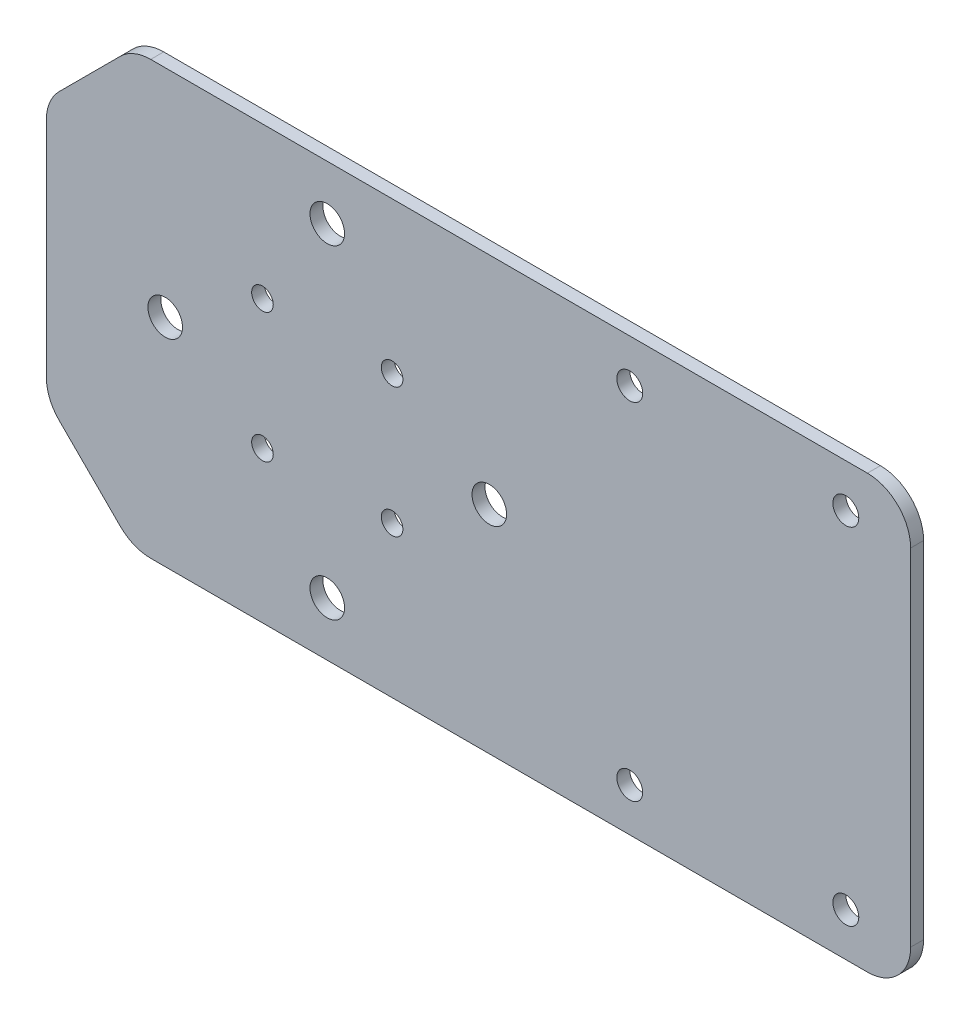
ISO-10303-21;
HEADER;
FILE_DESCRIPTION(('STEP AP214'),'2;1');
FILE_NAME('part.step','',(''),(''),'','','');
FILE_SCHEMA(('AUTOMOTIVE_DESIGN { 1 0 10303 214 1 1 1 1 }'));
ENDSEC;
DATA;
#1=APPLICATION_CONTEXT('core data for automotive mechanical design processes');
#2=APPLICATION_PROTOCOL_DEFINITION('international standard','automotive_design',2000,#1);
#3=PRODUCT_CONTEXT('',#1,'mechanical');
#4=PRODUCT('Part','Part','',(#3));
#5=PRODUCT_RELATED_PRODUCT_CATEGORY('part','',(#4));
#6=PRODUCT_DEFINITION_FORMATION('','',#4);
#7=PRODUCT_DEFINITION_CONTEXT('part definition',#1,'design');
#8=PRODUCT_DEFINITION('design','',#6,#7);
#9=PRODUCT_DEFINITION_SHAPE('','',#8);
#10=(LENGTH_UNIT() NAMED_UNIT(*) SI_UNIT(.MILLI.,.METRE.));
#11=(NAMED_UNIT(*) PLANE_ANGLE_UNIT() SI_UNIT($,.RADIAN.));
#12=(NAMED_UNIT(*) SI_UNIT($,.STERADIAN.) SOLID_ANGLE_UNIT());
#13=UNCERTAINTY_MEASURE_WITH_UNIT(LENGTH_MEASURE(1.E-05),#10,'distance_accuracy_value','');
#14=(GEOMETRIC_REPRESENTATION_CONTEXT(3) GLOBAL_UNCERTAINTY_ASSIGNED_CONTEXT((#13)) GLOBAL_UNIT_ASSIGNED_CONTEXT((#10,
#11,#12)) REPRESENTATION_CONTEXT('',''));
#15=CARTESIAN_POINT('',(0.,0.,0.));
#16=DIRECTION('',(0.,0.,1.));
#17=DIRECTION('',(1.,0.,0.));
#18=AXIS2_PLACEMENT_3D('',#15,#16,#17);
#19=CARTESIAN_POINT('',(15.,15.,7.));
#20=DIRECTION('',(0.,0.,1.));
#21=DIRECTION('',(1.,0.,0.));
#22=AXIS2_PLACEMENT_3D('',#19,#20,#21);
#23=CYLINDRICAL_SURFACE('',#22,2.49999999999999);
#24=CARTESIAN_POINT('',(15.,15.,0.));
#25=DIRECTION('',(0.,0.,1.));
#26=DIRECTION('',(1.,0.,0.));
#27=AXIS2_PLACEMENT_3D('',#24,#25,#26);
#28=CIRCLE('',#27,2.5);
#29=CARTESIAN_POINT('',(17.5,15.,0.));
#30=VERTEX_POINT('',#29);
#31=EDGE_CURVE('E209',#30,#30,#28,.T.);
#32=ORIENTED_EDGE('',*,*,#31,.F.);
#33=EDGE_LOOP('',(#32));
#34=FACE_BOUND('',#33,.T.);
#35=CARTESIAN_POINT('',(15.,15.,3.));
#36=DIRECTION('',(0.,0.,1.));
#37=DIRECTION('',(1.,0.,0.));
#38=AXIS2_PLACEMENT_3D('',#35,#36,#37);
#39=CIRCLE('',#38,2.49999999999999);
#40=CARTESIAN_POINT('',(17.5,15.,3.));
#41=VERTEX_POINT('',#40);
#42=EDGE_CURVE('E266',#41,#41,#39,.T.);
#43=ORIENTED_EDGE('',*,*,#42,.T.);
#44=EDGE_LOOP('',(#43));
#45=FACE_BOUND('',#44,.T.);
#46=ADVANCED_FACE('F35',(#34,#45),#23,.F.);
#47=CARTESIAN_POINT('',(-15.,15.,7.));
#48=DIRECTION('',(0.,0.,1.));
#49=DIRECTION('',(1.,0.,0.));
#50=AXIS2_PLACEMENT_3D('',#47,#48,#49);
#51=CYLINDRICAL_SURFACE('',#50,2.49999999999999);
#52=CARTESIAN_POINT('',(-15.,15.,0.));
#53=DIRECTION('',(0.,0.,1.));
#54=DIRECTION('',(1.,0.,0.));
#55=AXIS2_PLACEMENT_3D('',#52,#53,#54);
#56=CIRCLE('',#55,2.5);
#57=CARTESIAN_POINT('',(-12.5,15.,0.));
#58=VERTEX_POINT('',#57);
#59=EDGE_CURVE('E206',#58,#58,#56,.T.);
#60=ORIENTED_EDGE('',*,*,#59,.F.);
#61=EDGE_LOOP('',(#60));
#62=FACE_BOUND('',#61,.T.);
#63=CARTESIAN_POINT('',(-15.,15.,3.));
#64=DIRECTION('',(0.,0.,1.));
#65=DIRECTION('',(1.,0.,0.));
#66=AXIS2_PLACEMENT_3D('',#63,#64,#65);
#67=CIRCLE('',#66,2.49999999999999);
#68=CARTESIAN_POINT('',(-12.5,15.,3.));
#69=VERTEX_POINT('',#68);
#70=EDGE_CURVE('E261',#69,#69,#67,.T.);
#71=ORIENTED_EDGE('',*,*,#70,.T.);
#72=EDGE_LOOP('',(#71));
#73=FACE_BOUND('',#72,.T.);
#74=ADVANCED_FACE('F336',(#62,#73),#51,.F.);
#75=CARTESIAN_POINT('',(0.,0.,3.));
#76=DIRECTION('',(0.,0.,1.));
#77=DIRECTION('',(1.,0.,0.));
#78=AXIS2_PLACEMENT_3D('',#75,#76,#77);
#79=PLANE('',#78);
#80=CARTESIAN_POINT('',(37.5,0.,3.));
#81=DIRECTION('',(0.,0.,1.));
#82=DIRECTION('',(1.,0.,0.));
#83=AXIS2_PLACEMENT_3D('',#80,#81,#82);
#84=CIRCLE('',#83,4.);
#85=CARTESIAN_POINT('',(41.5,0.,3.));
#86=VERTEX_POINT('',#85);
#87=EDGE_CURVE('E254',#86,#86,#84,.T.);
#88=ORIENTED_EDGE('',*,*,#87,.F.);
#89=EDGE_LOOP('',(#88));
#90=FACE_BOUND('',#89,.T.);
#91=CARTESIAN_POINT('',(-15.,-15.,3.));
#92=DIRECTION('',(0.,0.,1.));
#93=DIRECTION('',(1.,0.,0.));
#94=AXIS2_PLACEMENT_3D('',#91,#92,#93);
#95=CIRCLE('',#94,2.49999999999999);
#96=CARTESIAN_POINT('',(-12.5,-15.,3.));
#97=VERTEX_POINT('',#96);
#98=EDGE_CURVE('E216',#97,#97,#95,.T.);
#99=ORIENTED_EDGE('',*,*,#98,.F.);
#100=EDGE_LOOP('',(#99));
#101=FACE_BOUND('',#100,.T.);
#102=CARTESIAN_POINT('',(15.,-15.,3.));
#103=DIRECTION('',(0.,0.,1.));
#104=DIRECTION('',(1.,0.,0.));
#105=AXIS2_PLACEMENT_3D('',#102,#103,#104);
#106=CIRCLE('',#105,2.49999999999999);
#107=CARTESIAN_POINT('',(17.5,-15.,3.));
#108=VERTEX_POINT('',#107);
#109=EDGE_CURVE('E222',#108,#108,#106,.T.);
#110=ORIENTED_EDGE('',*,*,#109,.F.);
#111=EDGE_LOOP('',(#110));
#112=FACE_BOUND('',#111,.T.);
#113=CARTESIAN_POINT('',(-37.5,3.92791650619852E-13,3.));
#114=DIRECTION('',(0.,0.,1.));
#115=DIRECTION('',(1.,0.,0.));
#116=AXIS2_PLACEMENT_3D('',#113,#114,#115);
#117=CIRCLE('',#116,4.00000000000001);
#118=CARTESIAN_POINT('',(-33.5,3.92791650619852E-13,3.));
#119=VERTEX_POINT('',#118);
#120=EDGE_CURVE('E223',#119,#119,#117,.T.);
#121=ORIENTED_EDGE('',*,*,#120,.F.);
#122=EDGE_LOOP('',(#121));
#123=FACE_BOUND('',#122,.T.);
#124=CARTESIAN_POINT('',(-2.61861100413235E-13,-37.5,3.));
#125=DIRECTION('',(0.,0.,1.));
#126=DIRECTION('',(1.,0.,0.));
#127=AXIS2_PLACEMENT_3D('',#124,#125,#126);
#128=CIRCLE('',#127,4.);
#129=CARTESIAN_POINT('',(3.99999999999974,-37.5,3.));
#130=VERTEX_POINT('',#129);
#131=EDGE_CURVE('E226',#130,#130,#128,.T.);
#132=ORIENTED_EDGE('',*,*,#131,.F.);
#133=EDGE_LOOP('',(#132));
#134=FACE_BOUND('',#133,.T.);
#135=CARTESIAN_POINT('',(0.,37.5,3.));
#136=DIRECTION('',(0.,0.,1.));
#137=DIRECTION('',(1.,0.,0.));
#138=AXIS2_PLACEMENT_3D('',#135,#136,#137);
#139=CIRCLE('',#138,4.);
#140=CARTESIAN_POINT('',(4.,37.5,3.));
#141=VERTEX_POINT('',#140);
#142=EDGE_CURVE('E230',#141,#141,#139,.T.);
#143=ORIENTED_EDGE('',*,*,#142,.F.);
#144=EDGE_LOOP('',(#143));
#145=FACE_BOUND('',#144,.T.);
#146=CARTESIAN_POINT('',(70.,-40.0019960171061,3.));
#147=DIRECTION('',(0.,0.,1.));
#148=DIRECTION('',(1.,0.,0.));
#149=AXIS2_PLACEMENT_3D('',#146,#147,#148);
#150=CIRCLE('',#149,3.00000000000002);
#151=CARTESIAN_POINT('',(73.,-40.0019960171061,3.));
#152=VERTEX_POINT('',#151);
#153=EDGE_CURVE('E271',#152,#152,#150,.T.);
#154=ORIENTED_EDGE('',*,*,#153,.F.);
#155=EDGE_LOOP('',(#154));
#156=FACE_BOUND('',#155,.T.);
#157=CARTESIAN_POINT('',(119.999999960159,-40.,3.));
#158=DIRECTION('',(0.,0.,1.));
#159=DIRECTION('',(1.,0.,0.));
#160=AXIS2_PLACEMENT_3D('',#157,#158,#159);
#161=CIRCLE('',#160,2.99999999999999);
#162=CARTESIAN_POINT('',(122.999999960159,-40.,3.));
#163=VERTEX_POINT('',#162);
#164=EDGE_CURVE('E276',#163,#163,#161,.T.);
#165=ORIENTED_EDGE('',*,*,#164,.F.);
#166=EDGE_LOOP('',(#165));
#167=FACE_BOUND('',#166,.T.);
#168=CARTESIAN_POINT('',(119.999999960159,40.,3.));
#169=DIRECTION('',(0.,0.,1.));
#170=DIRECTION('',(1.,0.,0.));
#171=AXIS2_PLACEMENT_3D('',#168,#169,#170);
#172=CIRCLE('',#171,2.99999999999999);
#173=CARTESIAN_POINT('',(122.999999960159,40.,3.));
#174=VERTEX_POINT('',#173);
#175=EDGE_CURVE('E282',#174,#174,#172,.T.);
#176=ORIENTED_EDGE('',*,*,#175,.F.);
#177=EDGE_LOOP('',(#176));
#178=FACE_BOUND('',#177,.T.);
#179=CARTESIAN_POINT('',(70.,39.9980039828939,3.));
#180=DIRECTION('',(0.,0.,1.));
#181=DIRECTION('',(1.,0.,0.));
#182=AXIS2_PLACEMENT_3D('',#179,#180,#181);
#183=CIRCLE('',#182,3.00000000000002);
#184=CARTESIAN_POINT('',(73.,39.9980039828939,3.));
#185=VERTEX_POINT('',#184);
#186=EDGE_CURVE('E288',#185,#185,#183,.T.);
#187=ORIENTED_EDGE('',*,*,#186,.F.);
#188=EDGE_LOOP('',(#187));
#189=FACE_BOUND('',#188,.T.);
#190=DIRECTION('',(-0.707106781186549,0.707106781186546,0.));
#191=VECTOR('',#190,1.);
#192=CARTESIAN_POINT('',(-47.4999999999999,-47.5,3.));
#193=LINE('',#192,#191);
#194=CARTESIAN_POINT('',(-62.0710678118655,-32.9289321881345,3.));
#195=VERTEX_POINT('',#194);
#196=CARTESIAN_POINT('',(-47.9289321881344,-47.0710678118655,3.));
#197=VERTEX_POINT('',#196);
#198=EDGE_CURVE('E130',#195,#197,#193,.F.);
#199=ORIENTED_EDGE('',*,*,#198,.T.);
#200=CARTESIAN_POINT('',(-40.857864376269,-40.,3.));
#201=DIRECTION('',(0.,0.,1.));
#202=DIRECTION('',(1.,0.,0.));
#203=AXIS2_PLACEMENT_3D('',#200,#201,#202);
#204=CIRCLE('',#203,10.);
#205=CARTESIAN_POINT('',(-40.857864376269,-50.,3.));
#206=VERTEX_POINT('',#205);
#207=EDGE_CURVE('E124',#197,#206,#204,.T.);
#208=ORIENTED_EDGE('',*,*,#207,.T.);
#209=DIRECTION('',(1.,0.,0.));
#210=VECTOR('',#209,1.);
#211=CARTESIAN_POINT('',(25.,-50.,3.));
#212=LINE('',#211,#210);
#213=CARTESIAN_POINT('',(125.,-50.,3.));
#214=VERTEX_POINT('',#213);
#215=EDGE_CURVE('E128',#206,#214,#212,.T.);
#216=ORIENTED_EDGE('',*,*,#215,.T.);
#217=CARTESIAN_POINT('',(125.,-40.,3.));
#218=DIRECTION('',(0.,0.,1.));
#219=DIRECTION('',(1.,0.,0.));
#220=AXIS2_PLACEMENT_3D('',#217,#218,#219);
#221=CIRCLE('',#220,10.);
#222=CARTESIAN_POINT('',(135.,-40.,3.));
#223=VERTEX_POINT('',#222);
#224=EDGE_CURVE('E58',#214,#223,#221,.T.);
#225=ORIENTED_EDGE('',*,*,#224,.T.);
#226=DIRECTION('',(0.,1.,0.));
#227=VECTOR('',#226,1.);
#228=CARTESIAN_POINT('',(135.,-50.,3.));
#229=LINE('',#228,#227);
#230=CARTESIAN_POINT('',(135.,40.,3.));
#231=VERTEX_POINT('',#230);
#232=EDGE_CURVE('E146',#223,#231,#229,.T.);
#233=ORIENTED_EDGE('',*,*,#232,.T.);
#234=CARTESIAN_POINT('',(125.,40.,3.));
#235=DIRECTION('',(0.,0.,1.));
#236=DIRECTION('',(1.,0.,0.));
#237=AXIS2_PLACEMENT_3D('',#234,#235,#236);
#238=CIRCLE('',#237,10.);
#239=CARTESIAN_POINT('',(125.,50.,3.));
#240=VERTEX_POINT('',#239);
#241=EDGE_CURVE('E50',#231,#240,#238,.T.);
#242=ORIENTED_EDGE('',*,*,#241,.T.);
#243=DIRECTION('',(-1.,0.,0.));
#244=VECTOR('',#243,1.);
#245=CARTESIAN_POINT('',(25.,50.,3.));
#246=LINE('',#245,#244);
#247=CARTESIAN_POINT('',(-40.857864376269,50.,3.));
#248=VERTEX_POINT('',#247);
#249=EDGE_CURVE('E200',#240,#248,#246,.T.);
#250=ORIENTED_EDGE('',*,*,#249,.T.);
#251=CARTESIAN_POINT('',(-40.857864376269,40.,3.));
#252=DIRECTION('',(0.,0.,1.));
#253=DIRECTION('',(1.,0.,0.));
#254=AXIS2_PLACEMENT_3D('',#251,#252,#253);
#255=CIRCLE('',#254,10.);
#256=CARTESIAN_POINT('',(-47.9289321881345,47.0710678118655,3.));
#257=VERTEX_POINT('',#256);
#258=EDGE_CURVE('E173',#248,#257,#255,.T.);
#259=ORIENTED_EDGE('',*,*,#258,.T.);
#260=DIRECTION('',(0.707106781186546,0.707106781186549,0.));
#261=VECTOR('',#260,1.);
#262=CARTESIAN_POINT('',(-47.5,47.4999999999999,3.));
#263=LINE('',#262,#261);
#264=CARTESIAN_POINT('',(-62.0710678118655,32.9289321881344,3.));
#265=VERTEX_POINT('',#264);
#266=EDGE_CURVE('E244',#257,#265,#263,.F.);
#267=ORIENTED_EDGE('',*,*,#266,.T.);
#268=CARTESIAN_POINT('',(-55.,25.8578643762689,3.));
#269=DIRECTION('',(0.,0.,1.));
#270=DIRECTION('',(1.,0.,0.));
#271=AXIS2_PLACEMENT_3D('',#268,#269,#270);
#272=CIRCLE('',#271,10.);
#273=CARTESIAN_POINT('',(-65.,25.8578643762689,3.));
#274=VERTEX_POINT('',#273);
#275=EDGE_CURVE('E175',#265,#274,#272,.T.);
#276=ORIENTED_EDGE('',*,*,#275,.T.);
#277=DIRECTION('',(0.,-1.,0.));
#278=VECTOR('',#277,1.);
#279=CARTESIAN_POINT('',(-65.,0.,3.));
#280=LINE('',#279,#278);
#281=CARTESIAN_POINT('',(-65.,-25.857864376269,3.));
#282=VERTEX_POINT('',#281);
#283=EDGE_CURVE('E253',#274,#282,#280,.T.);
#284=ORIENTED_EDGE('',*,*,#283,.T.);
#285=CARTESIAN_POINT('',(-55.,-25.857864376269,3.));
#286=DIRECTION('',(0.,0.,1.));
#287=DIRECTION('',(1.,0.,0.));
#288=AXIS2_PLACEMENT_3D('',#285,#286,#287);
#289=CIRCLE('',#288,10.);
#290=EDGE_CURVE('E135',#282,#195,#289,.T.);
#291=ORIENTED_EDGE('',*,*,#290,.T.);
#292=EDGE_LOOP('',(#199,#208,#216,#225,#233,#242,#250,#259,#267,#276,#284,#291));
#293=FACE_BOUND('',#292,.T.);
#294=ORIENTED_EDGE('',*,*,#42,.F.);
#295=EDGE_LOOP('',(#294));
#296=FACE_BOUND('',#295,.T.);
#297=ORIENTED_EDGE('',*,*,#70,.F.);
#298=EDGE_LOOP('',(#297));
#299=FACE_BOUND('',#298,.T.);
#300=ADVANCED_FACE('F126',(#90,#101,#112,#123,#134,#145,#156,#167,#178,#189,#293,#296,#299),#79,.T.);
#301=CARTESIAN_POINT('',(0.,0.,0.));
#302=DIRECTION('',(0.,0.,1.));
#303=DIRECTION('',(1.,0.,0.));
#304=AXIS2_PLACEMENT_3D('',#301,#302,#303);
#305=PLANE('',#304);
#306=CARTESIAN_POINT('',(37.5,0.,0.));
#307=DIRECTION('',(0.,0.,1.));
#308=DIRECTION('',(1.,0.,0.));
#309=AXIS2_PLACEMENT_3D('',#306,#307,#308);
#310=CIRCLE('',#309,4.);
#311=CARTESIAN_POINT('',(41.5,0.,0.));
#312=VERTEX_POINT('',#311);
#313=EDGE_CURVE('E251',#312,#312,#310,.T.);
#314=ORIENTED_EDGE('',*,*,#313,.T.);
#315=EDGE_LOOP('',(#314));
#316=FACE_BOUND('',#315,.T.);
#317=ORIENTED_EDGE('',*,*,#59,.T.);
#318=EDGE_LOOP('',(#317));
#319=FACE_BOUND('',#318,.T.);
#320=ORIENTED_EDGE('',*,*,#31,.T.);
#321=EDGE_LOOP('',(#320));
#322=FACE_BOUND('',#321,.T.);
#323=CARTESIAN_POINT('',(-15.,-15.,0.));
#324=DIRECTION('',(0.,0.,1.));
#325=DIRECTION('',(1.,0.,0.));
#326=AXIS2_PLACEMENT_3D('',#323,#324,#325);
#327=CIRCLE('',#326,2.5);
#328=CARTESIAN_POINT('',(-12.5,-15.,0.));
#329=VERTEX_POINT('',#328);
#330=EDGE_CURVE('E213',#329,#329,#327,.T.);
#331=ORIENTED_EDGE('',*,*,#330,.T.);
#332=EDGE_LOOP('',(#331));
#333=FACE_BOUND('',#332,.T.);
#334=CARTESIAN_POINT('',(15.,-15.,0.));
#335=DIRECTION('',(0.,0.,1.));
#336=DIRECTION('',(1.,0.,0.));
#337=AXIS2_PLACEMENT_3D('',#334,#335,#336);
#338=CIRCLE('',#337,2.5);
#339=CARTESIAN_POINT('',(17.5,-15.,0.));
#340=VERTEX_POINT('',#339);
#341=EDGE_CURVE('E219',#340,#340,#338,.T.);
#342=ORIENTED_EDGE('',*,*,#341,.T.);
#343=EDGE_LOOP('',(#342));
#344=FACE_BOUND('',#343,.T.);
#345=CARTESIAN_POINT('',(-37.5,3.92791650619852E-13,0.));
#346=DIRECTION('',(0.,0.,1.));
#347=DIRECTION('',(1.,0.,0.));
#348=AXIS2_PLACEMENT_3D('',#345,#346,#347);
#349=CIRCLE('',#348,4.00000000000001);
#350=CARTESIAN_POINT('',(-33.5,3.92791650619852E-13,0.));
#351=VERTEX_POINT('',#350);
#352=EDGE_CURVE('E233',#351,#351,#349,.T.);
#353=ORIENTED_EDGE('',*,*,#352,.T.);
#354=EDGE_LOOP('',(#353));
#355=FACE_BOUND('',#354,.T.);
#356=CARTESIAN_POINT('',(-2.61861100413235E-13,-37.5,0.));
#357=DIRECTION('',(0.,0.,1.));
#358=DIRECTION('',(1.,0.,0.));
#359=AXIS2_PLACEMENT_3D('',#356,#357,#358);
#360=CIRCLE('',#359,4.);
#361=CARTESIAN_POINT('',(3.99999999999974,-37.5,0.));
#362=VERTEX_POINT('',#361);
#363=EDGE_CURVE('E236',#362,#362,#360,.T.);
#364=ORIENTED_EDGE('',*,*,#363,.T.);
#365=EDGE_LOOP('',(#364));
#366=FACE_BOUND('',#365,.T.);
#367=CARTESIAN_POINT('',(0.,37.5,0.));
#368=DIRECTION('',(0.,0.,1.));
#369=DIRECTION('',(1.,0.,0.));
#370=AXIS2_PLACEMENT_3D('',#367,#368,#369);
#371=CIRCLE('',#370,4.);
#372=CARTESIAN_POINT('',(4.,37.5,0.));
#373=VERTEX_POINT('',#372);
#374=EDGE_CURVE('E227',#373,#373,#371,.T.);
#375=ORIENTED_EDGE('',*,*,#374,.T.);
#376=EDGE_LOOP('',(#375));
#377=FACE_BOUND('',#376,.T.);
#378=CARTESIAN_POINT('',(70.,-40.0019960171061,0.));
#379=DIRECTION('',(0.,0.,1.));
#380=DIRECTION('',(1.,0.,0.));
#381=AXIS2_PLACEMENT_3D('',#378,#379,#380);
#382=CIRCLE('',#381,3.00000000000002);
#383=CARTESIAN_POINT('',(73.,-40.0019960171061,0.));
#384=VERTEX_POINT('',#383);
#385=EDGE_CURVE('E273',#384,#384,#382,.T.);
#386=ORIENTED_EDGE('',*,*,#385,.T.);
#387=EDGE_LOOP('',(#386));
#388=FACE_BOUND('',#387,.T.);
#389=CARTESIAN_POINT('',(119.999999960159,-40.,0.));
#390=DIRECTION('',(0.,0.,1.));
#391=DIRECTION('',(1.,0.,0.));
#392=AXIS2_PLACEMENT_3D('',#389,#390,#391);
#393=CIRCLE('',#392,2.99999999999999);
#394=CARTESIAN_POINT('',(122.999999960159,-40.,0.));
#395=VERTEX_POINT('',#394);
#396=EDGE_CURVE('E279',#395,#395,#393,.T.);
#397=ORIENTED_EDGE('',*,*,#396,.T.);
#398=EDGE_LOOP('',(#397));
#399=FACE_BOUND('',#398,.T.);
#400=CARTESIAN_POINT('',(119.999999960159,40.,0.));
#401=DIRECTION('',(0.,0.,1.));
#402=DIRECTION('',(1.,0.,0.));
#403=AXIS2_PLACEMENT_3D('',#400,#401,#402);
#404=CIRCLE('',#403,2.99999999999999);
#405=CARTESIAN_POINT('',(122.999999960159,40.,0.));
#406=VERTEX_POINT('',#405);
#407=EDGE_CURVE('E285',#406,#406,#404,.T.);
#408=ORIENTED_EDGE('',*,*,#407,.T.);
#409=EDGE_LOOP('',(#408));
#410=FACE_BOUND('',#409,.T.);
#411=CARTESIAN_POINT('',(70.,39.9980039828939,0.));
#412=DIRECTION('',(0.,0.,1.));
#413=DIRECTION('',(1.,0.,0.));
#414=AXIS2_PLACEMENT_3D('',#411,#412,#413);
#415=CIRCLE('',#414,3.00000000000002);
#416=CARTESIAN_POINT('',(73.,39.9980039828939,0.));
#417=VERTEX_POINT('',#416);
#418=EDGE_CURVE('E147',#417,#417,#415,.T.);
#419=ORIENTED_EDGE('',*,*,#418,.T.);
#420=EDGE_LOOP('',(#419));
#421=FACE_BOUND('',#420,.T.);
#422=DIRECTION('',(1.,0.,0.));
#423=VECTOR('',#422,1.);
#424=CARTESIAN_POINT('',(25.,-50.,0.));
#425=LINE('',#424,#423);
#426=CARTESIAN_POINT('',(-40.857864376269,-50.,0.));
#427=VERTEX_POINT('',#426);
#428=CARTESIAN_POINT('',(125.,-50.,0.));
#429=VERTEX_POINT('',#428);
#430=EDGE_CURVE('E202',#427,#429,#425,.T.);
#431=ORIENTED_EDGE('',*,*,#430,.F.);
#432=CARTESIAN_POINT('',(-40.857864376269,-40.,0.));
#433=DIRECTION('',(0.,0.,1.));
#434=DIRECTION('',(1.,0.,0.));
#435=AXIS2_PLACEMENT_3D('',#432,#433,#434);
#436=CIRCLE('',#435,10.);
#437=CARTESIAN_POINT('',(-47.9289321881344,-47.0710678118655,0.));
#438=VERTEX_POINT('',#437);
#439=EDGE_CURVE('E150',#427,#438,#436,.F.);
#440=ORIENTED_EDGE('',*,*,#439,.T.);
#441=DIRECTION('',(0.707106781186549,-0.707106781186546,0.));
#442=VECTOR('',#441,1.);
#443=CARTESIAN_POINT('',(-65.,-30.,0.));
#444=LINE('',#443,#442);
#445=CARTESIAN_POINT('',(-62.0710678118655,-32.9289321881345,0.));
#446=VERTEX_POINT('',#445);
#447=EDGE_CURVE('E247',#438,#446,#444,.F.);
#448=ORIENTED_EDGE('',*,*,#447,.T.);
#449=CARTESIAN_POINT('',(-55.,-25.857864376269,0.));
#450=DIRECTION('',(0.,0.,1.));
#451=DIRECTION('',(1.,0.,0.));
#452=AXIS2_PLACEMENT_3D('',#449,#450,#451);
#453=CIRCLE('',#452,10.);
#454=CARTESIAN_POINT('',(-65.,-25.857864376269,0.));
#455=VERTEX_POINT('',#454);
#456=EDGE_CURVE('E164',#446,#455,#453,.F.);
#457=ORIENTED_EDGE('',*,*,#456,.T.);
#458=DIRECTION('',(0.,-1.,0.));
#459=VECTOR('',#458,1.);
#460=CARTESIAN_POINT('',(-65.,0.,0.));
#461=LINE('',#460,#459);
#462=CARTESIAN_POINT('',(-65.,25.8578643762689,0.));
#463=VERTEX_POINT('',#462);
#464=EDGE_CURVE('E258',#463,#455,#461,.T.);
#465=ORIENTED_EDGE('',*,*,#464,.F.);
#466=CARTESIAN_POINT('',(-55.,25.8578643762689,0.));
#467=DIRECTION('',(0.,0.,1.));
#468=DIRECTION('',(1.,0.,0.));
#469=AXIS2_PLACEMENT_3D('',#466,#467,#468);
#470=CIRCLE('',#469,10.);
#471=CARTESIAN_POINT('',(-62.0710678118655,32.9289321881344,0.));
#472=VERTEX_POINT('',#471);
#473=EDGE_CURVE('E162',#463,#472,#470,.F.);
#474=ORIENTED_EDGE('',*,*,#473,.T.);
#475=DIRECTION('',(-0.707106781186546,-0.707106781186549,0.));
#476=VECTOR('',#475,1.);
#477=CARTESIAN_POINT('',(-44.9999999999999,50.,0.));
#478=LINE('',#477,#476);
#479=CARTESIAN_POINT('',(-47.9289321881345,47.0710678118655,0.));
#480=VERTEX_POINT('',#479);
#481=EDGE_CURVE('E155',#472,#480,#478,.F.);
#482=ORIENTED_EDGE('',*,*,#481,.T.);
#483=CARTESIAN_POINT('',(-40.857864376269,40.,0.));
#484=DIRECTION('',(0.,0.,1.));
#485=DIRECTION('',(1.,0.,0.));
#486=AXIS2_PLACEMENT_3D('',#483,#484,#485);
#487=CIRCLE('',#486,10.);
#488=CARTESIAN_POINT('',(-40.857864376269,50.,0.));
#489=VERTEX_POINT('',#488);
#490=EDGE_CURVE('E160',#480,#489,#487,.F.);
#491=ORIENTED_EDGE('',*,*,#490,.T.);
#492=DIRECTION('',(-1.,0.,0.));
#493=VECTOR('',#492,1.);
#494=CARTESIAN_POINT('',(25.,50.,0.));
#495=LINE('',#494,#493);
#496=CARTESIAN_POINT('',(125.,50.,0.));
#497=VERTEX_POINT('',#496);
#498=EDGE_CURVE('E210',#497,#489,#495,.T.);
#499=ORIENTED_EDGE('',*,*,#498,.F.);
#500=CARTESIAN_POINT('',(125.,40.,0.));
#501=DIRECTION('',(0.,0.,1.));
#502=DIRECTION('',(1.,0.,0.));
#503=AXIS2_PLACEMENT_3D('',#500,#501,#502);
#504=CIRCLE('',#503,10.);
#505=CARTESIAN_POINT('',(135.,40.,0.));
#506=VERTEX_POINT('',#505);
#507=EDGE_CURVE('E151',#497,#506,#504,.F.);
#508=ORIENTED_EDGE('',*,*,#507,.T.);
#509=DIRECTION('',(0.,1.,0.));
#510=VECTOR('',#509,1.);
#511=CARTESIAN_POINT('',(135.,-50.,0.));
#512=LINE('',#511,#510);
#513=CARTESIAN_POINT('',(135.,-40.,0.));
#514=VERTEX_POINT('',#513);
#515=EDGE_CURVE('E196',#514,#506,#512,.T.);
#516=ORIENTED_EDGE('',*,*,#515,.F.);
#517=CARTESIAN_POINT('',(125.,-40.,0.));
#518=DIRECTION('',(0.,0.,1.));
#519=DIRECTION('',(1.,0.,0.));
#520=AXIS2_PLACEMENT_3D('',#517,#518,#519);
#521=CIRCLE('',#520,10.);
#522=EDGE_CURVE('E153',#514,#429,#521,.F.);
#523=ORIENTED_EDGE('',*,*,#522,.T.);
#524=EDGE_LOOP('',(#431,#440,#448,#457,#465,#474,#482,#491,#499,#508,#516,#523));
#525=FACE_BOUND('',#524,.T.);
#526=ADVANCED_FACE('F327',(#316,#319,#322,#333,#344,#355,#366,#377,#388,#399,#410,#421,#525),
#305,.F.);
#527=CARTESIAN_POINT('',(0.,37.5,3.));
#528=DIRECTION('',(0.,0.,-1.));
#529=DIRECTION('',(-1.,0.,0.));
#530=AXIS2_PLACEMENT_3D('',#527,#528,#529);
#531=CYLINDRICAL_SURFACE('',#530,4.);
#532=ORIENTED_EDGE('',*,*,#142,.T.);
#533=EDGE_LOOP('',(#532));
#534=FACE_BOUND('',#533,.T.);
#535=ORIENTED_EDGE('',*,*,#374,.F.);
#536=EDGE_LOOP('',(#535));
#537=FACE_BOUND('',#536,.T.);
#538=ADVANCED_FACE('F362',(#534,#537),#531,.F.);
#539=CARTESIAN_POINT('',(-2.61861100413235E-13,-37.5,3.));
#540=DIRECTION('',(0.,0.,-1.));
#541=DIRECTION('',(-1.,0.,0.));
#542=AXIS2_PLACEMENT_3D('',#539,#540,#541);
#543=CYLINDRICAL_SURFACE('',#542,4.);
#544=ORIENTED_EDGE('',*,*,#131,.T.);
#545=EDGE_LOOP('',(#544));
#546=FACE_BOUND('',#545,.T.);
#547=ORIENTED_EDGE('',*,*,#363,.F.);
#548=EDGE_LOOP('',(#547));
#549=FACE_BOUND('',#548,.T.);
#550=ADVANCED_FACE('F365',(#546,#549),#543,.F.);
#551=CARTESIAN_POINT('',(-37.5,3.92791650619852E-13,3.));
#552=DIRECTION('',(0.,0.,-1.));
#553=DIRECTION('',(-1.,0.,0.));
#554=AXIS2_PLACEMENT_3D('',#551,#552,#553);
#555=CYLINDRICAL_SURFACE('',#554,4.00000000000001);
#556=ORIENTED_EDGE('',*,*,#120,.T.);
#557=EDGE_LOOP('',(#556));
#558=FACE_BOUND('',#557,.T.);
#559=ORIENTED_EDGE('',*,*,#352,.F.);
#560=EDGE_LOOP('',(#559));
#561=FACE_BOUND('',#560,.T.);
#562=ADVANCED_FACE('F355',(#558,#561),#555,.F.);
#563=CARTESIAN_POINT('',(15.,-15.,7.));
#564=DIRECTION('',(0.,0.,1.));
#565=DIRECTION('',(1.,0.,0.));
#566=AXIS2_PLACEMENT_3D('',#563,#564,#565);
#567=CYLINDRICAL_SURFACE('',#566,2.49999999999999);
#568=ORIENTED_EDGE('',*,*,#109,.T.);
#569=EDGE_LOOP('',(#568));
#570=FACE_BOUND('',#569,.T.);
#571=ORIENTED_EDGE('',*,*,#341,.F.);
#572=EDGE_LOOP('',(#571));
#573=FACE_BOUND('',#572,.T.);
#574=ADVANCED_FACE('F351',(#570,#573),#567,.F.);
#575=CARTESIAN_POINT('',(-15.,-15.,7.));
#576=DIRECTION('',(0.,0.,1.));
#577=DIRECTION('',(1.,0.,0.));
#578=AXIS2_PLACEMENT_3D('',#575,#576,#577);
#579=CYLINDRICAL_SURFACE('',#578,2.49999999999999);
#580=ORIENTED_EDGE('',*,*,#98,.T.);
#581=EDGE_LOOP('',(#580));
#582=FACE_BOUND('',#581,.T.);
#583=ORIENTED_EDGE('',*,*,#330,.F.);
#584=EDGE_LOOP('',(#583));
#585=FACE_BOUND('',#584,.T.);
#586=ADVANCED_FACE('F348',(#582,#585),#579,.F.);
#587=CARTESIAN_POINT('',(135.,-50.,0.));
#588=DIRECTION('',(1.,0.,0.));
#589=DIRECTION('',(0.,0.,-1.));
#590=AXIS2_PLACEMENT_3D('',#587,#588,#589);
#591=PLANE('',#590);
#592=ORIENTED_EDGE('',*,*,#232,.F.);
#593=DIRECTION('',(0.,0.,1.));
#594=VECTOR('',#593,1.);
#595=CARTESIAN_POINT('',(135.,-40.,0.));
#596=LINE('',#595,#594);
#597=EDGE_CURVE('E11',#223,#514,#596,.F.);
#598=ORIENTED_EDGE('',*,*,#597,.T.);
#599=ORIENTED_EDGE('',*,*,#515,.T.);
#600=DIRECTION('',(0.,0.,1.));
#601=VECTOR('',#600,1.);
#602=CARTESIAN_POINT('',(135.,40.,0.));
#603=LINE('',#602,#601);
#604=EDGE_CURVE('E43',#506,#231,#603,.T.);
#605=ORIENTED_EDGE('',*,*,#604,.T.);
#606=EDGE_LOOP('',(#592,#598,#599,#605));
#607=FACE_BOUND('',#606,.T.);
#608=ADVANCED_FACE('F193',(#607),#591,.T.);
#609=CARTESIAN_POINT('',(70.,39.9980039828939,0.));
#610=DIRECTION('',(0.,0.,1.));
#611=DIRECTION('',(1.,0.,0.));
#612=AXIS2_PLACEMENT_3D('',#609,#610,#611);
#613=CYLINDRICAL_SURFACE('',#612,3.00000000000002);
#614=ORIENTED_EDGE('',*,*,#418,.F.);
#615=EDGE_LOOP('',(#614));
#616=FACE_BOUND('',#615,.T.);
#617=ORIENTED_EDGE('',*,*,#186,.T.);
#618=EDGE_LOOP('',(#617));
#619=FACE_BOUND('',#618,.T.);
#620=ADVANCED_FACE('F448',(#616,#619),#613,.F.);
#621=CARTESIAN_POINT('',(119.999999960159,40.,0.));
#622=DIRECTION('',(0.,0.,1.));
#623=DIRECTION('',(1.,0.,0.));
#624=AXIS2_PLACEMENT_3D('',#621,#622,#623);
#625=CYLINDRICAL_SURFACE('',#624,2.99999999999999);
#626=ORIENTED_EDGE('',*,*,#407,.F.);
#627=EDGE_LOOP('',(#626));
#628=FACE_BOUND('',#627,.T.);
#629=ORIENTED_EDGE('',*,*,#175,.T.);
#630=EDGE_LOOP('',(#629));
#631=FACE_BOUND('',#630,.T.);
#632=ADVANCED_FACE('F455',(#628,#631),#625,.F.);
#633=CARTESIAN_POINT('',(119.999999960159,-40.,0.));
#634=DIRECTION('',(0.,0.,1.));
#635=DIRECTION('',(1.,0.,0.));
#636=AXIS2_PLACEMENT_3D('',#633,#634,#635);
#637=CYLINDRICAL_SURFACE('',#636,2.99999999999999);
#638=ORIENTED_EDGE('',*,*,#396,.F.);
#639=EDGE_LOOP('',(#638));
#640=FACE_BOUND('',#639,.T.);
#641=ORIENTED_EDGE('',*,*,#164,.T.);
#642=EDGE_LOOP('',(#641));
#643=FACE_BOUND('',#642,.T.);
#644=ADVANCED_FACE('F463',(#640,#643),#637,.F.);
#645=CARTESIAN_POINT('',(70.,-40.0019960171061,0.));
#646=DIRECTION('',(0.,0.,1.));
#647=DIRECTION('',(1.,0.,0.));
#648=AXIS2_PLACEMENT_3D('',#645,#646,#647);
#649=CYLINDRICAL_SURFACE('',#648,3.00000000000002);
#650=ORIENTED_EDGE('',*,*,#385,.F.);
#651=EDGE_LOOP('',(#650));
#652=FACE_BOUND('',#651,.T.);
#653=ORIENTED_EDGE('',*,*,#153,.T.);
#654=EDGE_LOOP('',(#653));
#655=FACE_BOUND('',#654,.T.);
#656=ADVANCED_FACE('F471',(#652,#655),#649,.F.);
#657=CARTESIAN_POINT('',(25.,-50.,0.));
#658=DIRECTION('',(0.,-1.,0.));
#659=DIRECTION('',(0.,0.,-1.));
#660=AXIS2_PLACEMENT_3D('',#657,#658,#659);
#661=PLANE('',#660);
#662=ORIENTED_EDGE('',*,*,#215,.F.);
#663=DIRECTION('',(0.,0.,1.));
#664=VECTOR('',#663,1.);
#665=CARTESIAN_POINT('',(-40.857864376269,-50.,0.));
#666=LINE('',#665,#664);
#667=EDGE_CURVE('E142',#206,#427,#666,.F.);
#668=ORIENTED_EDGE('',*,*,#667,.T.);
#669=ORIENTED_EDGE('',*,*,#430,.T.);
#670=DIRECTION('',(0.,0.,1.));
#671=VECTOR('',#670,1.);
#672=CARTESIAN_POINT('',(125.,-50.,0.));
#673=LINE('',#672,#671);
#674=EDGE_CURVE('E145',#429,#214,#673,.T.);
#675=ORIENTED_EDGE('',*,*,#674,.T.);
#676=EDGE_LOOP('',(#662,#668,#669,#675));
#677=FACE_BOUND('',#676,.T.);
#678=ADVANCED_FACE('F140',(#677),#661,.T.);
#679=CARTESIAN_POINT('',(25.,50.,0.));
#680=DIRECTION('',(0.,1.,0.));
#681=DIRECTION('',(0.,0.,1.));
#682=AXIS2_PLACEMENT_3D('',#679,#680,#681);
#683=PLANE('',#682);
#684=ORIENTED_EDGE('',*,*,#498,.T.);
#685=DIRECTION('',(0.,0.,-1.));
#686=VECTOR('',#685,1.);
#687=CARTESIAN_POINT('',(-40.857864376269,50.,0.));
#688=LINE('',#687,#686);
#689=EDGE_CURVE('E189',#489,#248,#688,.F.);
#690=ORIENTED_EDGE('',*,*,#689,.T.);
#691=ORIENTED_EDGE('',*,*,#249,.F.);
#692=DIRECTION('',(0.,0.,1.));
#693=VECTOR('',#692,1.);
#694=CARTESIAN_POINT('',(125.,50.,0.));
#695=LINE('',#694,#693);
#696=EDGE_CURVE('E187',#240,#497,#695,.F.);
#697=ORIENTED_EDGE('',*,*,#696,.T.);
#698=EDGE_LOOP('',(#684,#690,#691,#697));
#699=FACE_BOUND('',#698,.T.);
#700=ADVANCED_FACE('F300',(#699),#683,.T.);
#701=CARTESIAN_POINT('',(-65.,0.,0.));
#702=DIRECTION('',(-1.,0.,0.));
#703=DIRECTION('',(0.,-1.,0.));
#704=AXIS2_PLACEMENT_3D('',#701,#702,#703);
#705=PLANE('',#704);
#706=ORIENTED_EDGE('',*,*,#464,.T.);
#707=DIRECTION('',(0.,0.,-1.));
#708=VECTOR('',#707,1.);
#709=CARTESIAN_POINT('',(-65.,-25.857864376269,0.));
#710=LINE('',#709,#708);
#711=EDGE_CURVE('E180',#455,#282,#710,.F.);
#712=ORIENTED_EDGE('',*,*,#711,.T.);
#713=ORIENTED_EDGE('',*,*,#283,.F.);
#714=DIRECTION('',(0.,0.,1.));
#715=VECTOR('',#714,1.);
#716=CARTESIAN_POINT('',(-65.,25.8578643762689,0.));
#717=LINE('',#716,#715);
#718=EDGE_CURVE('E134',#274,#463,#717,.F.);
#719=ORIENTED_EDGE('',*,*,#718,.T.);
#720=EDGE_LOOP('',(#706,#712,#713,#719));
#721=FACE_BOUND('',#720,.T.);
#722=ADVANCED_FACE('F317',(#721),#705,.T.);
#723=CARTESIAN_POINT('',(-44.9999999999999,50.,0.));
#724=DIRECTION('',(0.707106781186549,-0.707106781186546,0.));
#725=DIRECTION('',(0.,0.,1.));
#726=AXIS2_PLACEMENT_3D('',#723,#724,#725);
#727=PLANE('',#726);
#728=ORIENTED_EDGE('',*,*,#481,.F.);
#729=DIRECTION('',(0.,0.,-1.));
#730=VECTOR('',#729,1.);
#731=CARTESIAN_POINT('',(-62.0710678118655,32.9289321881344,0.));
#732=LINE('',#731,#730);
#733=EDGE_CURVE('E185',#472,#265,#732,.F.);
#734=ORIENTED_EDGE('',*,*,#733,.T.);
#735=ORIENTED_EDGE('',*,*,#266,.F.);
#736=DIRECTION('',(0.,0.,1.));
#737=VECTOR('',#736,1.);
#738=CARTESIAN_POINT('',(-47.9289321881345,47.0710678118655,0.));
#739=LINE('',#738,#737);
#740=EDGE_CURVE('E183',#257,#480,#739,.F.);
#741=ORIENTED_EDGE('',*,*,#740,.T.);
#742=EDGE_LOOP('',(#728,#734,#735,#741));
#743=FACE_BOUND('',#742,.T.);
#744=ADVANCED_FACE('F310',(#743),#727,.F.);
#745=CARTESIAN_POINT('',(-65.,-30.,0.));
#746=DIRECTION('',(0.707106781186546,0.707106781186549,0.));
#747=DIRECTION('',(0.,0.,1.));
#748=AXIS2_PLACEMENT_3D('',#745,#746,#747);
#749=PLANE('',#748);
#750=ORIENTED_EDGE('',*,*,#447,.F.);
#751=DIRECTION('',(0.,0.,-1.));
#752=VECTOR('',#751,1.);
#753=CARTESIAN_POINT('',(-47.9289321881344,-47.0710678118655,0.));
#754=LINE('',#753,#752);
#755=EDGE_CURVE('E169',#438,#197,#754,.F.);
#756=ORIENTED_EDGE('',*,*,#755,.T.);
#757=ORIENTED_EDGE('',*,*,#198,.F.);
#758=DIRECTION('',(0.,0.,1.));
#759=VECTOR('',#758,1.);
#760=CARTESIAN_POINT('',(-62.0710678118655,-32.9289321881345,0.));
#761=LINE('',#760,#759);
#762=EDGE_CURVE('E167',#195,#446,#761,.F.);
#763=ORIENTED_EDGE('',*,*,#762,.T.);
#764=EDGE_LOOP('',(#750,#756,#757,#763));
#765=FACE_BOUND('',#764,.T.);
#766=ADVANCED_FACE('F326',(#765),#749,.F.);
#767=CARTESIAN_POINT('',(37.5,0.,-12.));
#768=DIRECTION('',(0.,0.,1.));
#769=DIRECTION('',(1.,0.,0.));
#770=AXIS2_PLACEMENT_3D('',#767,#768,#769);
#771=CYLINDRICAL_SURFACE('',#770,4.);
#772=ORIENTED_EDGE('',*,*,#87,.T.);
#773=EDGE_LOOP('',(#772));
#774=FACE_BOUND('',#773,.T.);
#775=ORIENTED_EDGE('',*,*,#313,.F.);
#776=EDGE_LOOP('',(#775));
#777=FACE_BOUND('',#776,.T.);
#778=ADVANCED_FACE('F377',(#774,#777),#771,.F.);
#779=CARTESIAN_POINT('',(-40.857864376269,-40.,0.));
#780=DIRECTION('',(0.,0.,1.));
#781=DIRECTION('',(1.,0.,0.));
#782=AXIS2_PLACEMENT_3D('',#779,#780,#781);
#783=CYLINDRICAL_SURFACE('',#782,10.);
#784=ORIENTED_EDGE('',*,*,#207,.F.);
#785=ORIENTED_EDGE('',*,*,#755,.F.);
#786=ORIENTED_EDGE('',*,*,#439,.F.);
#787=ORIENTED_EDGE('',*,*,#667,.F.);
#788=EDGE_LOOP('',(#784,#785,#786,#787));
#789=FACE_BOUND('',#788,.T.);
#790=ADVANCED_FACE('F149',(#789),#783,.T.);
#791=CARTESIAN_POINT('',(-55.,-25.857864376269,0.));
#792=DIRECTION('',(0.,0.,-1.));
#793=DIRECTION('',(-1.,0.,0.));
#794=AXIS2_PLACEMENT_3D('',#791,#792,#793);
#795=CYLINDRICAL_SURFACE('',#794,10.);
#796=ORIENTED_EDGE('',*,*,#456,.F.);
#797=ORIENTED_EDGE('',*,*,#762,.F.);
#798=ORIENTED_EDGE('',*,*,#290,.F.);
#799=ORIENTED_EDGE('',*,*,#711,.F.);
#800=EDGE_LOOP('',(#796,#797,#798,#799));
#801=FACE_BOUND('',#800,.T.);
#802=ADVANCED_FACE('F322',(#801),#795,.T.);
#803=CARTESIAN_POINT('',(-55.,25.8578643762689,0.));
#804=DIRECTION('',(0.,0.,1.));
#805=DIRECTION('',(1.,0.,0.));
#806=AXIS2_PLACEMENT_3D('',#803,#804,#805);
#807=CYLINDRICAL_SURFACE('',#806,10.);
#808=ORIENTED_EDGE('',*,*,#275,.F.);
#809=ORIENTED_EDGE('',*,*,#733,.F.);
#810=ORIENTED_EDGE('',*,*,#473,.F.);
#811=ORIENTED_EDGE('',*,*,#718,.F.);
#812=EDGE_LOOP('',(#808,#809,#810,#811));
#813=FACE_BOUND('',#812,.T.);
#814=ADVANCED_FACE('F313',(#813),#807,.T.);
#815=CARTESIAN_POINT('',(-40.857864376269,40.,0.));
#816=DIRECTION('',(0.,0.,-1.));
#817=DIRECTION('',(-1.,0.,0.));
#818=AXIS2_PLACEMENT_3D('',#815,#816,#817);
#819=CYLINDRICAL_SURFACE('',#818,10.);
#820=ORIENTED_EDGE('',*,*,#490,.F.);
#821=ORIENTED_EDGE('',*,*,#740,.F.);
#822=ORIENTED_EDGE('',*,*,#258,.F.);
#823=ORIENTED_EDGE('',*,*,#689,.F.);
#824=EDGE_LOOP('',(#820,#821,#822,#823));
#825=FACE_BOUND('',#824,.T.);
#826=ADVANCED_FACE('F304',(#825),#819,.T.);
#827=CARTESIAN_POINT('',(125.,-40.,0.));
#828=DIRECTION('',(0.,0.,1.));
#829=DIRECTION('',(1.,0.,0.));
#830=AXIS2_PLACEMENT_3D('',#827,#828,#829);
#831=CYLINDRICAL_SURFACE('',#830,10.);
#832=ORIENTED_EDGE('',*,*,#522,.F.);
#833=ORIENTED_EDGE('',*,*,#597,.F.);
#834=ORIENTED_EDGE('',*,*,#224,.F.);
#835=ORIENTED_EDGE('',*,*,#674,.F.);
#836=EDGE_LOOP('',(#832,#833,#834,#835));
#837=FACE_BOUND('',#836,.T.);
#838=ADVANCED_FACE('F330',(#837),#831,.T.);
#839=CARTESIAN_POINT('',(125.,40.,0.));
#840=DIRECTION('',(0.,0.,1.));
#841=DIRECTION('',(1.,0.,0.));
#842=AXIS2_PLACEMENT_3D('',#839,#840,#841);
#843=CYLINDRICAL_SURFACE('',#842,10.);
#844=ORIENTED_EDGE('',*,*,#507,.F.);
#845=ORIENTED_EDGE('',*,*,#696,.F.);
#846=ORIENTED_EDGE('',*,*,#241,.F.);
#847=ORIENTED_EDGE('',*,*,#604,.F.);
#848=EDGE_LOOP('',(#844,#845,#846,#847));
#849=FACE_BOUND('',#848,.T.);
#850=ADVANCED_FACE('F37',(#849),#843,.T.);
#851=CLOSED_SHELL('',(#46,#74,#300,#526,#538,#550,#562,#574,#586,#608,#620,#632,#644,#656,#678,
#700,#722,#744,#766,#778,#790,#802,#814,#826,#838,#850));
#852=MANIFOLD_SOLID_BREP('B2',#851);
#853=ADVANCED_BREP_SHAPE_REPRESENTATION('',(#18,#852),#14);
#854=SHAPE_DEFINITION_REPRESENTATION(#9,#853);
ENDSEC;
END-ISO-10303-21;
